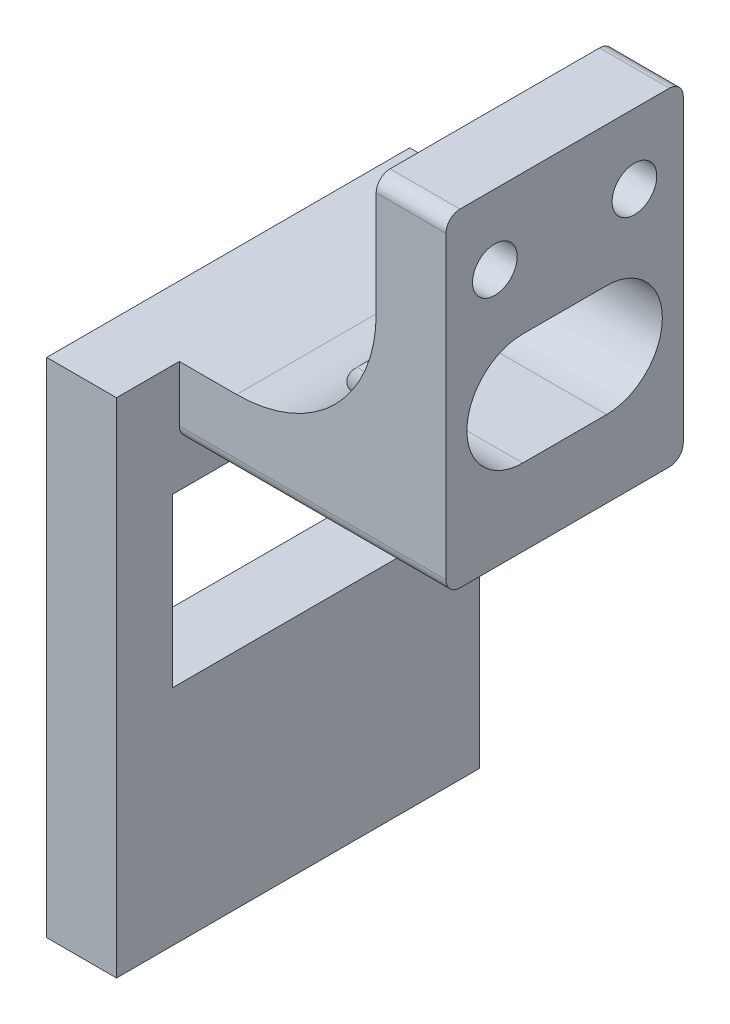
ISO-10303-21;
HEADER;
FILE_DESCRIPTION(('STEP AP214'),'2;1');
FILE_NAME('part.step','',(''),(''),'','','');
FILE_SCHEMA(('AUTOMOTIVE_DESIGN { 1 0 10303 214 1 1 1 1 }'));
ENDSEC;
DATA;
#1=APPLICATION_CONTEXT('core data for automotive mechanical design processes');
#2=APPLICATION_PROTOCOL_DEFINITION('international standard','automotive_design',2000,#1);
#3=PRODUCT_CONTEXT('',#1,'mechanical');
#4=PRODUCT('Part','Part','',(#3));
#5=PRODUCT_RELATED_PRODUCT_CATEGORY('part','',(#4));
#6=PRODUCT_DEFINITION_FORMATION('','',#4);
#7=PRODUCT_DEFINITION_CONTEXT('part definition',#1,'design');
#8=PRODUCT_DEFINITION('design','',#6,#7);
#9=PRODUCT_DEFINITION_SHAPE('','',#8);
#10=(LENGTH_UNIT() NAMED_UNIT(*) SI_UNIT(.MILLI.,.METRE.));
#11=(NAMED_UNIT(*) PLANE_ANGLE_UNIT() SI_UNIT($,.RADIAN.));
#12=(NAMED_UNIT(*) SI_UNIT($,.STERADIAN.) SOLID_ANGLE_UNIT());
#13=UNCERTAINTY_MEASURE_WITH_UNIT(LENGTH_MEASURE(1.E-05),#10,'distance_accuracy_value','');
#14=(GEOMETRIC_REPRESENTATION_CONTEXT(3) GLOBAL_UNCERTAINTY_ASSIGNED_CONTEXT((#13)) GLOBAL_UNIT_ASSIGNED_CONTEXT((#10,
#11,#12)) REPRESENTATION_CONTEXT('',''));
#15=CARTESIAN_POINT('',(0.,0.,0.));
#16=DIRECTION('',(0.,0.,1.));
#17=DIRECTION('',(1.,0.,0.));
#18=AXIS2_PLACEMENT_3D('',#15,#16,#17);
#19=CARTESIAN_POINT('',(-3.,27.5,0.));
#20=DIRECTION('',(0.,-1.,0.));
#21=DIRECTION('',(0.,0.,-1.));
#22=AXIS2_PLACEMENT_3D('',#19,#20,#21);
#23=PLANE('',#22);
#24=DIRECTION('',(-1.,0.,0.));
#25=VECTOR('',#24,1.);
#26=CARTESIAN_POINT('',(16.1,27.5,8.49999999999999));
#27=LINE('',#26,#25);
#28=CARTESIAN_POINT('',(1.10000000000003,27.5,8.49999999999999));
#29=VERTEX_POINT('',#28);
#30=CARTESIAN_POINT('',(-3.,27.5,8.49999999999999));
#31=VERTEX_POINT('',#30);
#32=EDGE_CURVE('E243',#29,#31,#27,.T.);
#33=ORIENTED_EDGE('',*,*,#32,.F.);
#34=DIRECTION('',(0.,0.,1.));
#35=VECTOR('',#34,1.);
#36=CARTESIAN_POINT('',(1.10000000000003,27.5,-8.49999999999998));
#37=LINE('',#36,#35);
#38=CARTESIAN_POINT('',(1.10000000000003,27.5,-8.49999999999998));
#39=VERTEX_POINT('',#38);
#40=EDGE_CURVE('E323',#29,#39,#37,.F.);
#41=ORIENTED_EDGE('',*,*,#40,.T.);
#42=DIRECTION('',(-1.,0.,0.));
#43=VECTOR('',#42,1.);
#44=CARTESIAN_POINT('',(16.1,27.5,-8.49999999999998));
#45=LINE('',#44,#43);
#46=CARTESIAN_POINT('',(-3.,27.5,-8.49999999999998));
#47=VERTEX_POINT('',#46);
#48=EDGE_CURVE('E245',#39,#47,#45,.T.);
#49=ORIENTED_EDGE('',*,*,#48,.T.);
#50=DIRECTION('',(0.,0.,1.));
#51=VECTOR('',#50,1.);
#52=CARTESIAN_POINT('',(-3.,27.5,0.));
#53=LINE('',#52,#51);
#54=CARTESIAN_POINT('',(-3.,27.5,-13.));
#55=VERTEX_POINT('',#54);
#56=EDGE_CURVE('E261',#55,#47,#53,.T.);
#57=ORIENTED_EDGE('',*,*,#56,.F.);
#58=DIRECTION('',(-1.,0.,0.));
#59=VECTOR('',#58,1.);
#60=CARTESIAN_POINT('',(-3.,27.5,-13.));
#61=LINE('',#60,#59);
#62=CARTESIAN_POINT('',(-7.99999999999999,27.5,-13.));
#63=VERTEX_POINT('',#62);
#64=EDGE_CURVE('E306',#55,#63,#61,.T.);
#65=ORIENTED_EDGE('',*,*,#64,.T.);
#66=DIRECTION('',(0.,0.,1.));
#67=VECTOR('',#66,1.);
#68=CARTESIAN_POINT('',(-7.99999999999999,27.5,0.));
#69=LINE('',#68,#67);
#70=CARTESIAN_POINT('',(-7.99999999999999,27.5,13.));
#71=VERTEX_POINT('',#70);
#72=EDGE_CURVE('E284',#63,#71,#69,.T.);
#73=ORIENTED_EDGE('',*,*,#72,.T.);
#74=DIRECTION('',(-1.,0.,0.));
#75=VECTOR('',#74,1.);
#76=CARTESIAN_POINT('',(-3.,27.5,13.));
#77=LINE('',#76,#75);
#78=CARTESIAN_POINT('',(-3.,27.5,13.));
#79=VERTEX_POINT('',#78);
#80=EDGE_CURVE('E317',#79,#71,#77,.T.);
#81=ORIENTED_EDGE('',*,*,#80,.F.);
#82=EDGE_CURVE('E259',#31,#79,#53,.T.);
#83=ORIENTED_EDGE('',*,*,#82,.F.);
#84=EDGE_LOOP('',(#33,#41,#49,#57,#65,#73,#81,#83));
#85=FACE_BOUND('',#84,.T.);
#86=ADVANCED_FACE('F39',(#85),#23,.F.);
#87=CARTESIAN_POINT('',(-3.,19.5,0.));
#88=DIRECTION('',(0.,-1.,0.));
#89=DIRECTION('',(0.,0.,-1.));
#90=AXIS2_PLACEMENT_3D('',#87,#88,#89);
#91=PLANE('',#90);
#92=DIRECTION('',(0.,0.,1.));
#93=VECTOR('',#92,1.);
#94=CARTESIAN_POINT('',(-7.99999999999999,19.5,0.));
#95=LINE('',#94,#93);
#96=CARTESIAN_POINT('',(-7.99999999999999,19.5,-9.));
#97=VERTEX_POINT('',#96);
#98=CARTESIAN_POINT('',(-7.99999999999999,19.5,9.));
#99=VERTEX_POINT('',#98);
#100=EDGE_CURVE('E292',#97,#99,#95,.T.);
#101=ORIENTED_EDGE('',*,*,#100,.F.);
#102=DIRECTION('',(-1.,0.,0.));
#103=VECTOR('',#102,1.);
#104=CARTESIAN_POINT('',(-3.,19.5,-9.));
#105=LINE('',#104,#103);
#106=CARTESIAN_POINT('',(-3.,19.5,-9.));
#107=VERTEX_POINT('',#106);
#108=EDGE_CURVE('E311',#107,#97,#105,.T.);
#109=ORIENTED_EDGE('',*,*,#108,.F.);
#110=DIRECTION('',(0.,0.,1.));
#111=VECTOR('',#110,1.);
#112=CARTESIAN_POINT('',(-3.,19.5,0.));
#113=LINE('',#112,#111);
#114=CARTESIAN_POINT('',(-3.,19.5,9.));
#115=VERTEX_POINT('',#114);
#116=EDGE_CURVE('E270',#107,#115,#113,.T.);
#117=ORIENTED_EDGE('',*,*,#116,.T.);
#118=DIRECTION('',(-1.,0.,0.));
#119=VECTOR('',#118,1.);
#120=CARTESIAN_POINT('',(-3.,19.5,9.));
#121=LINE('',#120,#119);
#122=EDGE_CURVE('E303',#115,#99,#121,.T.);
#123=ORIENTED_EDGE('',*,*,#122,.T.);
#124=EDGE_LOOP('',(#101,#109,#117,#123));
#125=FACE_BOUND('',#124,.T.);
#126=ADVANCED_FACE('F385',(#125),#91,.T.);
#127=CARTESIAN_POINT('',(-3.,0.,-9.));
#128=DIRECTION('',(0.,0.,-1.));
#129=DIRECTION('',(0.,1.,0.));
#130=AXIS2_PLACEMENT_3D('',#127,#128,#129);
#131=PLANE('',#130);
#132=DIRECTION('',(0.,-1.,0.));
#133=VECTOR('',#132,1.);
#134=CARTESIAN_POINT('',(-7.99999999999999,0.,-9.));
#135=LINE('',#134,#133);
#136=CARTESIAN_POINT('',(-7.99999999999999,7.5,-9.));
#137=VERTEX_POINT('',#136);
#138=EDGE_CURVE('E295',#97,#137,#135,.T.);
#139=ORIENTED_EDGE('',*,*,#138,.T.);
#140=DIRECTION('',(-1.,0.,0.));
#141=VECTOR('',#140,1.);
#142=CARTESIAN_POINT('',(-3.,7.5,-9.));
#143=LINE('',#142,#141);
#144=CARTESIAN_POINT('',(-3.,7.5,-9.));
#145=VERTEX_POINT('',#144);
#146=EDGE_CURVE('E308',#145,#137,#143,.T.);
#147=ORIENTED_EDGE('',*,*,#146,.F.);
#148=DIRECTION('',(0.,-1.,0.));
#149=VECTOR('',#148,1.);
#150=CARTESIAN_POINT('',(-3.,0.,-9.));
#151=LINE('',#150,#149);
#152=EDGE_CURVE('E273',#107,#145,#151,.T.);
#153=ORIENTED_EDGE('',*,*,#152,.F.);
#154=ORIENTED_EDGE('',*,*,#108,.T.);
#155=EDGE_LOOP('',(#139,#147,#153,#154));
#156=FACE_BOUND('',#155,.T.);
#157=ADVANCED_FACE('F381',(#156),#131,.F.);
#158=CARTESIAN_POINT('',(-3.,7.5,0.));
#159=DIRECTION('',(0.,-1.,0.));
#160=DIRECTION('',(0.,0.,-1.));
#161=AXIS2_PLACEMENT_3D('',#158,#159,#160);
#162=PLANE('',#161);
#163=DIRECTION('',(0.,0.,1.));
#164=VECTOR('',#163,1.);
#165=CARTESIAN_POINT('',(-7.99999999999999,7.5,0.));
#166=LINE('',#165,#164);
#167=CARTESIAN_POINT('',(-7.99999999999999,7.5,9.00000000000001));
#168=VERTEX_POINT('',#167);
#169=EDGE_CURVE('E298',#137,#168,#166,.T.);
#170=ORIENTED_EDGE('',*,*,#169,.T.);
#171=DIRECTION('',(-1.,0.,0.));
#172=VECTOR('',#171,1.);
#173=CARTESIAN_POINT('',(-3.,7.5,9.00000000000001));
#174=LINE('',#173,#172);
#175=CARTESIAN_POINT('',(-3.,7.5,9.00000000000001));
#176=VERTEX_POINT('',#175);
#177=EDGE_CURVE('E305',#176,#168,#174,.T.);
#178=ORIENTED_EDGE('',*,*,#177,.F.);
#179=DIRECTION('',(0.,0.,1.));
#180=VECTOR('',#179,1.);
#181=CARTESIAN_POINT('',(-3.,7.5,0.));
#182=LINE('',#181,#180);
#183=EDGE_CURVE('E276',#145,#176,#182,.T.);
#184=ORIENTED_EDGE('',*,*,#183,.F.);
#185=ORIENTED_EDGE('',*,*,#146,.T.);
#186=EDGE_LOOP('',(#170,#178,#184,#185));
#187=FACE_BOUND('',#186,.T.);
#188=ADVANCED_FACE('F377',(#187),#162,.F.);
#189=CARTESIAN_POINT('',(-3.,0.,-13.));
#190=DIRECTION('',(0.,0.,-1.));
#191=DIRECTION('',(0.,1.,0.));
#192=AXIS2_PLACEMENT_3D('',#189,#190,#191);
#193=PLANE('',#192);
#194=DIRECTION('',(0.,-1.,0.));
#195=VECTOR('',#194,1.);
#196=CARTESIAN_POINT('',(-7.99999999999999,0.,-13.));
#197=LINE('',#196,#195);
#198=CARTESIAN_POINT('',(-7.99999999999999,-8.5,-13.));
#199=VERTEX_POINT('',#198);
#200=EDGE_CURVE('E255',#63,#199,#197,.T.);
#201=ORIENTED_EDGE('',*,*,#200,.F.);
#202=ORIENTED_EDGE('',*,*,#64,.F.);
#203=DIRECTION('',(0.,-1.,0.));
#204=VECTOR('',#203,1.);
#205=CARTESIAN_POINT('',(-3.,0.,-13.));
#206=LINE('',#205,#204);
#207=CARTESIAN_POINT('',(-3.,-8.5,-13.));
#208=VERTEX_POINT('',#207);
#209=EDGE_CURVE('E256',#55,#208,#206,.T.);
#210=ORIENTED_EDGE('',*,*,#209,.T.);
#211=DIRECTION('',(-1.,0.,0.));
#212=VECTOR('',#211,1.);
#213=CARTESIAN_POINT('',(-3.,-8.5,-13.));
#214=LINE('',#213,#212);
#215=EDGE_CURVE('E281',#208,#199,#214,.T.);
#216=ORIENTED_EDGE('',*,*,#215,.T.);
#217=EDGE_LOOP('',(#201,#202,#210,#216));
#218=FACE_BOUND('',#217,.T.);
#219=ADVANCED_FACE('F380',(#218),#193,.T.);
#220=CARTESIAN_POINT('',(-3.,0.,13.));
#221=DIRECTION('',(0.,0.,1.));
#222=DIRECTION('',(0.,-1.,0.));
#223=AXIS2_PLACEMENT_3D('',#220,#221,#222);
#224=PLANE('',#223);
#225=DIRECTION('',(0.,1.,0.));
#226=VECTOR('',#225,1.);
#227=CARTESIAN_POINT('',(-7.99999999999999,0.,13.));
#228=LINE('',#227,#226);
#229=CARTESIAN_POINT('',(-7.99999999999999,-8.5,13.));
#230=VERTEX_POINT('',#229);
#231=EDGE_CURVE('E286',#230,#71,#228,.T.);
#232=ORIENTED_EDGE('',*,*,#231,.F.);
#233=DIRECTION('',(-1.,0.,0.));
#234=VECTOR('',#233,1.);
#235=CARTESIAN_POINT('',(-3.,-8.5,13.));
#236=LINE('',#235,#234);
#237=CARTESIAN_POINT('',(-3.,-8.5,13.));
#238=VERTEX_POINT('',#237);
#239=EDGE_CURVE('E315',#238,#230,#236,.T.);
#240=ORIENTED_EDGE('',*,*,#239,.F.);
#241=DIRECTION('',(0.,1.,0.));
#242=VECTOR('',#241,1.);
#243=CARTESIAN_POINT('',(-3.,0.,13.));
#244=LINE('',#243,#242);
#245=EDGE_CURVE('E264',#238,#79,#244,.T.);
#246=ORIENTED_EDGE('',*,*,#245,.T.);
#247=ORIENTED_EDGE('',*,*,#80,.T.);
#248=EDGE_LOOP('',(#232,#240,#246,#247));
#249=FACE_BOUND('',#248,.T.);
#250=ADVANCED_FACE('F392',(#249),#224,.T.);
#251=CARTESIAN_POINT('',(-3.,-8.5,0.));
#252=DIRECTION('',(0.,-1.,0.));
#253=DIRECTION('',(0.,0.,-1.));
#254=AXIS2_PLACEMENT_3D('',#251,#252,#253);
#255=PLANE('',#254);
#256=DIRECTION('',(0.,0.,1.));
#257=VECTOR('',#256,1.);
#258=CARTESIAN_POINT('',(-7.99999999999999,-8.5,0.));
#259=LINE('',#258,#257);
#260=EDGE_CURVE('E289',#199,#230,#259,.T.);
#261=ORIENTED_EDGE('',*,*,#260,.F.);
#262=ORIENTED_EDGE('',*,*,#215,.F.);
#263=DIRECTION('',(0.,0.,1.));
#264=VECTOR('',#263,1.);
#265=CARTESIAN_POINT('',(-3.,-8.5,0.));
#266=LINE('',#265,#264);
#267=EDGE_CURVE('E267',#208,#238,#266,.T.);
#268=ORIENTED_EDGE('',*,*,#267,.T.);
#269=ORIENTED_EDGE('',*,*,#239,.T.);
#270=EDGE_LOOP('',(#261,#262,#268,#269));
#271=FACE_BOUND('',#270,.T.);
#272=ADVANCED_FACE('F375',(#271),#255,.T.);
#273=CARTESIAN_POINT('',(-3.,0.,9.00000000000001));
#274=DIRECTION('',(0.,0.,-1.));
#275=DIRECTION('',(0.,1.,0.));
#276=AXIS2_PLACEMENT_3D('',#273,#274,#275);
#277=PLANE('',#276);
#278=DIRECTION('',(0.,-1.,0.));
#279=VECTOR('',#278,1.);
#280=CARTESIAN_POINT('',(-7.99999999999999,0.,9.00000000000001));
#281=LINE('',#280,#279);
#282=EDGE_CURVE('E260',#99,#168,#281,.T.);
#283=ORIENTED_EDGE('',*,*,#282,.F.);
#284=ORIENTED_EDGE('',*,*,#122,.F.);
#285=DIRECTION('',(0.,-1.,0.));
#286=VECTOR('',#285,1.);
#287=CARTESIAN_POINT('',(-3.,0.,9.00000000000001));
#288=LINE('',#287,#286);
#289=EDGE_CURVE('E278',#115,#176,#288,.T.);
#290=ORIENTED_EDGE('',*,*,#289,.T.);
#291=ORIENTED_EDGE('',*,*,#177,.T.);
#292=EDGE_LOOP('',(#283,#284,#290,#291));
#293=FACE_BOUND('',#292,.T.);
#294=ADVANCED_FACE('F369',(#293),#277,.T.);
#295=CARTESIAN_POINT('',(-3.,0.,0.));
#296=DIRECTION('',(1.,0.,0.));
#297=DIRECTION('',(0.,0.,-1.));
#298=AXIS2_PLACEMENT_3D('',#295,#296,#297);
#299=PLANE('',#298);
#300=DIRECTION('',(0.,1.,0.));
#301=VECTOR('',#300,1.);
#302=CARTESIAN_POINT('',(-3.,0.,-8.49999999999998));
#303=LINE('',#302,#301);
#304=CARTESIAN_POINT('',(-3.,23.5,-8.49999999999998));
#305=VERTEX_POINT('',#304);
#306=EDGE_CURVE('E253',#305,#47,#303,.T.);
#307=ORIENTED_EDGE('',*,*,#306,.F.);
#308=CARTESIAN_POINT('',(-3.,23.5,-7.49999999999998));
#309=DIRECTION('',(1.,0.,0.));
#310=DIRECTION('',(0.,0.,-1.));
#311=AXIS2_PLACEMENT_3D('',#308,#309,#310);
#312=CIRCLE('',#311,1.);
#313=CARTESIAN_POINT('',(-3.,22.5,-7.49999999999998));
#314=VERTEX_POINT('',#313);
#315=EDGE_CURVE('E11',#305,#314,#312,.F.);
#316=ORIENTED_EDGE('',*,*,#315,.T.);
#317=DIRECTION('',(0.,0.,-1.));
#318=VECTOR('',#317,1.);
#319=CARTESIAN_POINT('',(-3.,22.5,0.));
#320=LINE('',#319,#318);
#321=CARTESIAN_POINT('',(-3.,22.5,7.49999999999998));
#322=VERTEX_POINT('',#321);
#323=EDGE_CURVE('E248',#322,#314,#320,.T.);
#324=ORIENTED_EDGE('',*,*,#323,.F.);
#325=CARTESIAN_POINT('',(-3.,23.5,7.49999999999998));
#326=DIRECTION('',(1.,0.,0.));
#327=DIRECTION('',(0.,0.,-1.));
#328=AXIS2_PLACEMENT_3D('',#325,#326,#327);
#329=CIRCLE('',#328,1.);
#330=CARTESIAN_POINT('',(-3.,23.5,8.49999999999999));
#331=VERTEX_POINT('',#330);
#332=EDGE_CURVE('E47',#322,#331,#329,.F.);
#333=ORIENTED_EDGE('',*,*,#332,.T.);
#334=DIRECTION('',(0.,-1.,0.));
#335=VECTOR('',#334,1.);
#336=CARTESIAN_POINT('',(-3.,0.,8.49999999999999));
#337=LINE('',#336,#335);
#338=EDGE_CURVE('E250',#31,#331,#337,.T.);
#339=ORIENTED_EDGE('',*,*,#338,.F.);
#340=ORIENTED_EDGE('',*,*,#82,.T.);
#341=ORIENTED_EDGE('',*,*,#245,.F.);
#342=ORIENTED_EDGE('',*,*,#267,.F.);
#343=ORIENTED_EDGE('',*,*,#209,.F.);
#344=ORIENTED_EDGE('',*,*,#56,.T.);
#345=EDGE_LOOP('',(#307,#316,#324,#333,#339,#340,#341,#342,#343,#344));
#346=FACE_BOUND('',#345,.T.);
#347=ORIENTED_EDGE('',*,*,#116,.F.);
#348=ORIENTED_EDGE('',*,*,#152,.T.);
#349=ORIENTED_EDGE('',*,*,#183,.T.);
#350=ORIENTED_EDGE('',*,*,#289,.F.);
#351=EDGE_LOOP('',(#347,#348,#349,#350));
#352=FACE_BOUND('',#351,.T.);
#353=ADVANCED_FACE('F366',(#346,#352),#299,.T.);
#354=CARTESIAN_POINT('',(-7.99999999999999,0.,0.));
#355=DIRECTION('',(1.,0.,0.));
#356=DIRECTION('',(0.,0.,-1.));
#357=AXIS2_PLACEMENT_3D('',#354,#355,#356);
#358=PLANE('',#357);
#359=ORIENTED_EDGE('',*,*,#231,.T.);
#360=ORIENTED_EDGE('',*,*,#72,.F.);
#361=ORIENTED_EDGE('',*,*,#200,.T.);
#362=ORIENTED_EDGE('',*,*,#260,.T.);
#363=EDGE_LOOP('',(#359,#360,#361,#362));
#364=FACE_BOUND('',#363,.T.);
#365=ORIENTED_EDGE('',*,*,#100,.T.);
#366=ORIENTED_EDGE('',*,*,#282,.T.);
#367=ORIENTED_EDGE('',*,*,#169,.F.);
#368=ORIENTED_EDGE('',*,*,#138,.F.);
#369=EDGE_LOOP('',(#365,#366,#367,#368));
#370=FACE_BOUND('',#369,.T.);
#371=ADVANCED_FACE('F364',(#364,#370),#358,.F.);
#372=CARTESIAN_POINT('',(16.1,0.,-8.49999999999998));
#373=DIRECTION('',(0.,0.,-1.));
#374=DIRECTION('',(0.,1.,0.));
#375=AXIS2_PLACEMENT_3D('',#372,#373,#374);
#376=PLANE('',#375);
#377=DIRECTION('',(0.,-1.,0.));
#378=VECTOR('',#377,1.);
#379=CARTESIAN_POINT('',(11.1,0.,-8.49999999999998));
#380=LINE('',#379,#378);
#381=CARTESIAN_POINT('',(11.1,45.,-8.49999999999999));
#382=VERTEX_POINT('',#381);
#383=CARTESIAN_POINT('',(11.1,37.5,-8.49999999999998));
#384=VERTEX_POINT('',#383);
#385=EDGE_CURVE('E471',#382,#384,#380,.T.);
#386=ORIENTED_EDGE('',*,*,#385,.F.);
#387=DIRECTION('',(1.,0.,0.));
#388=VECTOR('',#387,1.);
#389=CARTESIAN_POINT('',(16.1,45.,-8.49999999999999));
#390=LINE('',#389,#388);
#391=CARTESIAN_POINT('',(16.1,45.,-8.49999999999999));
#392=VERTEX_POINT('',#391);
#393=EDGE_CURVE('E438',#382,#392,#390,.T.);
#394=ORIENTED_EDGE('',*,*,#393,.T.);
#395=DIRECTION('',(0.,-1.,0.));
#396=VECTOR('',#395,1.);
#397=CARTESIAN_POINT('',(16.1,0.,-8.49999999999998));
#398=LINE('',#397,#396);
#399=CARTESIAN_POINT('',(16.1,23.5,-8.49999999999998));
#400=VERTEX_POINT('',#399);
#401=EDGE_CURVE('E230',#392,#400,#398,.T.);
#402=ORIENTED_EDGE('',*,*,#401,.T.);
#403=DIRECTION('',(-1.,0.,0.));
#404=VECTOR('',#403,1.);
#405=CARTESIAN_POINT('',(16.1,23.5,-8.49999999999998));
#406=LINE('',#405,#404);
#407=EDGE_CURVE('E435',#400,#305,#406,.T.);
#408=ORIENTED_EDGE('',*,*,#407,.T.);
#409=ORIENTED_EDGE('',*,*,#306,.T.);
#410=ORIENTED_EDGE('',*,*,#48,.F.);
#411=CARTESIAN_POINT('',(1.10000000000003,37.5,-8.49999999999998));
#412=DIRECTION('',(0.,0.,-1.));
#413=DIRECTION('',(0.,1.,0.));
#414=AXIS2_PLACEMENT_3D('',#411,#412,#413);
#415=CIRCLE('',#414,10.);
#416=EDGE_CURVE('E327',#39,#384,#415,.F.);
#417=ORIENTED_EDGE('',*,*,#416,.T.);
#418=EDGE_LOOP('',(#386,#394,#402,#408,#409,#410,#417));
#419=FACE_BOUND('',#418,.T.);
#420=ADVANCED_FACE('F360',(#419),#376,.T.);
#421=CARTESIAN_POINT('',(16.1,0.,8.49999999999999));
#422=DIRECTION('',(0.,0.,1.));
#423=DIRECTION('',(1.,0.,0.));
#424=AXIS2_PLACEMENT_3D('',#421,#422,#423);
#425=PLANE('',#424);
#426=DIRECTION('',(0.,1.,0.));
#427=VECTOR('',#426,1.);
#428=CARTESIAN_POINT('',(16.1,0.,8.49999999999999));
#429=LINE('',#428,#427);
#430=CARTESIAN_POINT('',(16.1,23.5,8.49999999999999));
#431=VERTEX_POINT('',#430);
#432=CARTESIAN_POINT('',(16.1,45.,8.49999999999999));
#433=VERTEX_POINT('',#432);
#434=EDGE_CURVE('E237',#431,#433,#429,.T.);
#435=ORIENTED_EDGE('',*,*,#434,.T.);
#436=DIRECTION('',(1.,0.,0.));
#437=VECTOR('',#436,1.);
#438=CARTESIAN_POINT('',(11.1,45.,8.49999999999999));
#439=LINE('',#438,#437);
#440=CARTESIAN_POINT('',(11.1,45.,8.49999999999999));
#441=VERTEX_POINT('',#440);
#442=EDGE_CURVE('E423',#433,#441,#439,.F.);
#443=ORIENTED_EDGE('',*,*,#442,.T.);
#444=DIRECTION('',(0.,1.,0.));
#445=VECTOR('',#444,1.);
#446=CARTESIAN_POINT('',(11.1,0.,8.49999999999999));
#447=LINE('',#446,#445);
#448=CARTESIAN_POINT('',(11.1,37.5,8.49999999999999));
#449=VERTEX_POINT('',#448);
#450=EDGE_CURVE('E205',#449,#441,#447,.T.);
#451=ORIENTED_EDGE('',*,*,#450,.F.);
#452=CARTESIAN_POINT('',(1.10000000000003,37.5,8.49999999999999));
#453=DIRECTION('',(0.,0.,1.));
#454=DIRECTION('',(1.,0.,0.));
#455=AXIS2_PLACEMENT_3D('',#452,#453,#454);
#456=CIRCLE('',#455,10.);
#457=EDGE_CURVE('E325',#449,#29,#456,.F.);
#458=ORIENTED_EDGE('',*,*,#457,.T.);
#459=ORIENTED_EDGE('',*,*,#32,.T.);
#460=ORIENTED_EDGE('',*,*,#338,.T.);
#461=DIRECTION('',(-1.,0.,0.));
#462=VECTOR('',#461,1.);
#463=CARTESIAN_POINT('',(16.1,23.5,8.49999999999999));
#464=LINE('',#463,#462);
#465=EDGE_CURVE('E418',#331,#431,#464,.F.);
#466=ORIENTED_EDGE('',*,*,#465,.T.);
#467=EDGE_LOOP('',(#435,#443,#451,#458,#459,#460,#466));
#468=FACE_BOUND('',#467,.T.);
#469=ADVANCED_FACE('F356',(#468),#425,.T.);
#470=CARTESIAN_POINT('',(16.1,22.5,0.));
#471=DIRECTION('',(0.,-1.,0.));
#472=DIRECTION('',(0.,0.,-1.));
#473=AXIS2_PLACEMENT_3D('',#470,#471,#472);
#474=PLANE('',#473);
#475=DIRECTION('',(0.,0.,1.));
#476=VECTOR('',#475,1.);
#477=CARTESIAN_POINT('',(16.1,22.5,0.));
#478=LINE('',#477,#476);
#479=CARTESIAN_POINT('',(16.1,22.5,-7.49999999999998));
#480=VERTEX_POINT('',#479);
#481=CARTESIAN_POINT('',(16.1,22.5,7.49999999999998));
#482=VERTEX_POINT('',#481);
#483=EDGE_CURVE('E240',#480,#482,#478,.T.);
#484=ORIENTED_EDGE('',*,*,#483,.T.);
#485=DIRECTION('',(-1.,0.,0.));
#486=VECTOR('',#485,1.);
#487=CARTESIAN_POINT('',(16.1,22.5,7.49999999999998));
#488=LINE('',#487,#486);
#489=EDGE_CURVE('E443',#482,#322,#488,.T.);
#490=ORIENTED_EDGE('',*,*,#489,.T.);
#491=ORIENTED_EDGE('',*,*,#323,.T.);
#492=DIRECTION('',(-1.,0.,0.));
#493=VECTOR('',#492,1.);
#494=CARTESIAN_POINT('',(16.1,22.5,-7.49999999999998));
#495=LINE('',#494,#493);
#496=EDGE_CURVE('E441',#314,#480,#495,.F.);
#497=ORIENTED_EDGE('',*,*,#496,.T.);
#498=EDGE_LOOP('',(#484,#490,#491,#497));
#499=FACE_BOUND('',#498,.T.);
#500=ADVANCED_FACE('F352',(#499),#474,.T.);
#501=CARTESIAN_POINT('',(16.1,0.,0.));
#502=DIRECTION('',(1.,0.,0.));
#503=DIRECTION('',(0.,0.,-1.));
#504=AXIS2_PLACEMENT_3D('',#501,#502,#503);
#505=PLANE('',#504);
#506=CARTESIAN_POINT('',(16.1,41.,5.));
#507=DIRECTION('',(-1.,0.,0.));
#508=DIRECTION('',(0.,0.,1.));
#509=AXIS2_PLACEMENT_3D('',#506,#507,#508);
#510=CIRCLE('',#509,1.59999999999999);
#511=CARTESIAN_POINT('',(16.1,41.,6.59999999999999));
#512=VERTEX_POINT('',#511);
#513=EDGE_CURVE('E506',#512,#512,#510,.T.);
#514=ORIENTED_EDGE('',*,*,#513,.T.);
#515=EDGE_LOOP('',(#514));
#516=FACE_BOUND('',#515,.T.);
#517=CARTESIAN_POINT('',(16.1,41.,-5.));
#518=DIRECTION('',(-1.,0.,0.));
#519=DIRECTION('',(0.,0.,1.));
#520=AXIS2_PLACEMENT_3D('',#517,#518,#519);
#521=CIRCLE('',#520,1.59999999999999);
#522=CARTESIAN_POINT('',(16.1,41.,-3.40000000000001));
#523=VERTEX_POINT('',#522);
#524=EDGE_CURVE('E214',#523,#523,#521,.T.);
#525=ORIENTED_EDGE('',*,*,#524,.T.);
#526=EDGE_LOOP('',(#525));
#527=FACE_BOUND('',#526,.T.);
#528=DIRECTION('',(0.,0.,-1.));
#529=VECTOR('',#528,1.);
#530=CARTESIAN_POINT('',(16.1,46.,0.));
#531=LINE('',#530,#529);
#532=CARTESIAN_POINT('',(16.1,46.,7.49999999999998));
#533=VERTEX_POINT('',#532);
#534=CARTESIAN_POINT('',(16.1,46.,-7.49999999999998));
#535=VERTEX_POINT('',#534);
#536=EDGE_CURVE('E225',#533,#535,#531,.T.);
#537=ORIENTED_EDGE('',*,*,#536,.F.);
#538=CARTESIAN_POINT('',(16.1,45.,7.49999999999998));
#539=DIRECTION('',(1.,0.,0.));
#540=DIRECTION('',(0.,0.,-1.));
#541=AXIS2_PLACEMENT_3D('',#538,#539,#540);
#542=CIRCLE('',#541,1.);
#543=EDGE_CURVE('E424',#533,#433,#542,.T.);
#544=ORIENTED_EDGE('',*,*,#543,.T.);
#545=ORIENTED_EDGE('',*,*,#434,.F.);
#546=CARTESIAN_POINT('',(16.1,23.5,7.49999999999998));
#547=DIRECTION('',(1.,0.,0.));
#548=DIRECTION('',(0.,0.,-1.));
#549=AXIS2_PLACEMENT_3D('',#546,#547,#548);
#550=CIRCLE('',#549,1.);
#551=EDGE_CURVE('E422',#431,#482,#550,.T.);
#552=ORIENTED_EDGE('',*,*,#551,.T.);
#553=ORIENTED_EDGE('',*,*,#483,.F.);
#554=CARTESIAN_POINT('',(16.1,23.5,-7.49999999999998));
#555=DIRECTION('',(1.,0.,0.));
#556=DIRECTION('',(0.,0.,-1.));
#557=AXIS2_PLACEMENT_3D('',#554,#555,#556);
#558=CIRCLE('',#557,1.);
#559=EDGE_CURVE('E450',#480,#400,#558,.T.);
#560=ORIENTED_EDGE('',*,*,#559,.T.);
#561=ORIENTED_EDGE('',*,*,#401,.F.);
#562=CARTESIAN_POINT('',(16.1,45.,-7.49999999999998));
#563=DIRECTION('',(1.,0.,0.));
#564=DIRECTION('',(0.,0.,-1.));
#565=AXIS2_PLACEMENT_3D('',#562,#563,#564);
#566=CIRCLE('',#565,1.);
#567=EDGE_CURVE('E428',#392,#535,#566,.T.);
#568=ORIENTED_EDGE('',*,*,#567,.T.);
#569=EDGE_LOOP('',(#537,#544,#545,#552,#553,#560,#561,#568));
#570=FACE_BOUND('',#569,.T.);
#571=CARTESIAN_POINT('',(16.1,32.,3.));
#572=DIRECTION('',(1.,0.,0.));
#573=DIRECTION('',(0.,0.,-1.));
#574=AXIS2_PLACEMENT_3D('',#571,#572,#573);
#575=CIRCLE('',#574,4.);
#576=CARTESIAN_POINT('',(16.1,36.,3.));
#577=VERTEX_POINT('',#576);
#578=CARTESIAN_POINT('',(16.1,28.,3.));
#579=VERTEX_POINT('',#578);
#580=EDGE_CURVE('E197',#577,#579,#575,.T.);
#581=ORIENTED_EDGE('',*,*,#580,.F.);
#582=DIRECTION('',(0.,0.,-1.));
#583=VECTOR('',#582,1.);
#584=CARTESIAN_POINT('',(16.1,36.,0.));
#585=LINE('',#584,#583);
#586=CARTESIAN_POINT('',(16.1,36.,-3.));
#587=VERTEX_POINT('',#586);
#588=EDGE_CURVE('E211',#577,#587,#585,.T.);
#589=ORIENTED_EDGE('',*,*,#588,.T.);
#590=CARTESIAN_POINT('',(16.1,32.,-3.));
#591=DIRECTION('',(1.,0.,0.));
#592=DIRECTION('',(0.,0.,-1.));
#593=AXIS2_PLACEMENT_3D('',#590,#591,#592);
#594=CIRCLE('',#593,4.);
#595=CARTESIAN_POINT('',(16.1,28.,-3.));
#596=VERTEX_POINT('',#595);
#597=EDGE_CURVE('E219',#596,#587,#594,.T.);
#598=ORIENTED_EDGE('',*,*,#597,.F.);
#599=DIRECTION('',(0.,0.,-1.));
#600=VECTOR('',#599,1.);
#601=CARTESIAN_POINT('',(16.1,28.,0.));
#602=LINE('',#601,#600);
#603=EDGE_CURVE('E212',#579,#596,#602,.T.);
#604=ORIENTED_EDGE('',*,*,#603,.F.);
#605=EDGE_LOOP('',(#581,#589,#598,#604));
#606=FACE_BOUND('',#605,.T.);
#607=ADVANCED_FACE('F209',(#516,#527,#570,#606),#505,.T.);
#608=CARTESIAN_POINT('',(11.1,32.,3.));
#609=DIRECTION('',(1.,0.,0.));
#610=DIRECTION('',(0.,0.,-1.));
#611=AXIS2_PLACEMENT_3D('',#608,#609,#610);
#612=CYLINDRICAL_SURFACE('',#611,4.);
#613=ORIENTED_EDGE('',*,*,#580,.T.);
#614=DIRECTION('',(1.,0.,0.));
#615=VECTOR('',#614,1.);
#616=CARTESIAN_POINT('',(11.1,28.,3.));
#617=LINE('',#616,#615);
#618=CARTESIAN_POINT('',(4.22249899919922,28.,3.));
#619=VERTEX_POINT('',#618);
#620=EDGE_CURVE('E228',#619,#579,#617,.T.);
#621=ORIENTED_EDGE('',*,*,#620,.F.);
#622=CARTESIAN_POINT('',(10.9868599666426,36.,3.));
#623=CARTESIAN_POINT('',(10.9868479827591,36.0000124956564,3.11065273715817));
#624=CARTESIAN_POINT('',(10.9861629937013,35.9954090060291,3.22130452800159));
#625=CARTESIAN_POINT('',(10.9833603553701,35.9770595619022,3.4418281389028));
#626=CARTESIAN_POINT('',(10.9812427211235,35.9633137032952,3.55169996712924));
#627=CARTESIAN_POINT('',(10.9754885008148,35.9267712771089,3.76987447286974));
#628=CARTESIAN_POINT('',(10.9718521021311,35.9039758260456,3.8781773422501));
#629=CARTESIAN_POINT('',(10.9628931775093,35.8495139320419,4.09245620342123));
#630=CARTESIAN_POINT('',(10.9575706849471,35.8178476646995,4.19843224122687));
#631=CARTESIAN_POINT('',(10.9450173447552,35.745871652728,4.40735940266136));
#632=CARTESIAN_POINT('',(10.9377854181495,35.7055570235374,4.51030877932607));
#633=CARTESIAN_POINT('',(10.9211442497524,35.616606069611,4.71241175442091));
#634=CARTESIAN_POINT('',(10.9117342055031,35.567966679608,4.81156393816749));
#635=CARTESIAN_POINT('',(10.8904448131492,35.4628296564918,5.00522828683833));
#636=CARTESIAN_POINT('',(10.8785674955628,35.4063384978036,5.09974418875774));
#637=CARTESIAN_POINT('',(10.8520121816604,35.285940820404,5.28356478144382));
#638=CARTESIAN_POINT('',(10.8373331747026,35.2220316290861,5.37286757648126));
#639=CARTESIAN_POINT('',(10.8050126330426,35.0880653866629,5.54472094061092));
#640=CARTESIAN_POINT('',(10.7874018169336,35.0180753511804,5.62732952889165));
#641=CARTESIAN_POINT('',(10.7488101236003,34.872041304612,5.78622067244468));
#642=CARTESIAN_POINT('',(10.7278280196142,34.7959950948738,5.86250090954382));
#643=CARTESIAN_POINT('',(10.6822387639376,34.638635719326,6.00817093575527));
#644=CARTESIAN_POINT('',(10.6576330622612,34.5573246675476,6.07756346253679));
#645=CARTESIAN_POINT('',(10.6045617434146,34.3901775677784,6.20910669208334));
#646=CARTESIAN_POINT('',(10.5760947236662,34.3043398824984,6.27125474805634));
#647=CARTESIAN_POINT('',(10.515553163567,34.13017143463,6.38720688264458));
#648=CARTESIAN_POINT('',(10.4835310000425,34.0418883160073,6.44110996139387));
#649=CARTESIAN_POINT('',(10.4154915040306,33.8625808796726,6.5413767233548));
#650=CARTESIAN_POINT('',(10.3794727435034,33.7715555906631,6.58773769698055));
#651=CARTESIAN_POINT('',(10.3034521416043,33.5876664548922,6.67281512492297));
#652=CARTESIAN_POINT('',(10.2634519308341,33.4948033731806,6.71153468955518));
#653=CARTESIAN_POINT('',(10.1795189895616,33.308001251495,6.78141441262132));
#654=CARTESIAN_POINT('',(10.1355848134587,33.2140618271504,6.81257177646486));
#655=CARTESIAN_POINT('',(9.99464012211637,32.924818044324,6.89691464363982));
#656=CARTESIAN_POINT('',(9.89126327900113,32.7289088993974,6.93786190442079));
#657=CARTESIAN_POINT('',(9.66977598428343,32.3416240527031,6.99018699436401));
#658=CARTESIAN_POINT('',(9.55165641739181,32.1502512435809,7.00154643379225));
#659=CARTESIAN_POINT('',(9.33990030634386,31.8317495956785,6.99862499697376));
#660=CARTESIAN_POINT('',(9.24939464147155,31.7024028530705,6.9909503034296));
#661=CARTESIAN_POINT('',(9.06296365691927,31.4488879321757,6.96390310001088));
#662=CARTESIAN_POINT('',(8.96703659364466,31.3247214425023,6.94452680711481));
#663=CARTESIAN_POINT('',(8.77044278037766,31.0821560389288,6.89524108973467));
#664=CARTESIAN_POINT('',(8.6697703444902,30.9637644086279,6.86531873599961));
#665=CARTESIAN_POINT('',(8.4644877021805,30.7333059666151,6.79604636075578));
#666=CARTESIAN_POINT('',(8.35987648266358,30.621240800916,6.75669389957231));
#667=CARTESIAN_POINT('',(8.11125966999197,30.3667166935284,6.65472902523723));
#668=CARTESIAN_POINT('',(7.96594835457156,30.2268718282866,6.58875685618546));
#669=CARTESIAN_POINT('',(7.67087139648043,29.9592200107369,6.44360437967718));
#670=CARTESIAN_POINT('',(7.52110393766529,29.8314180575657,6.36441862458868));
#671=CARTESIAN_POINT('',(7.2181267370543,29.5875776649953,6.19411779339115));
#672=CARTESIAN_POINT('',(7.06490955661393,29.4715683753374,6.10297437401114));
#673=CARTESIAN_POINT('',(6.75677004810543,29.2515595914474,5.90989694953952));
#674=CARTESIAN_POINT('',(6.60184826529813,29.1475563724572,5.80796630998268));
#675=CARTESIAN_POINT('',(6.31536151766561,28.9662898194854,5.60993757827554));
#676=CARTESIAN_POINT('',(6.18382634964,28.8873650613934,5.51530870755196));
#677=CARTESIAN_POINT('',(5.92170311287801,28.7379267092916,5.31822985218724));
#678=CARTESIAN_POINT('',(5.79111549766578,28.6674169218093,5.21577636217167));
#679=CARTESIAN_POINT('',(5.53320946221873,28.5352042147962,5.00271161060782));
#680=CARTESIAN_POINT('',(5.40587954538735,28.4734652867934,4.89213670835925));
#681=CARTESIAN_POINT('',(5.15672337450107,28.3587920720631,4.660814925648));
#682=CARTESIAN_POINT('',(5.03489046793264,28.3058469228935,4.54008087629683));
#683=CARTESIAN_POINT('',(4.84025685073249,28.2254285061661,4.32700658159359));
#684=CARTESIAN_POINT('',(4.76450674347699,28.1953042856961,4.2383847520467));
#685=CARTESIAN_POINT('',(4.6207450501206,28.1399654294771,4.05331978522656));
#686=CARTESIAN_POINT('',(4.55273882727615,28.1147541878635,3.95687130560449));
#687=CARTESIAN_POINT('',(4.4423550767018,28.0749596189402,3.77514473784431));
#688=CARTESIAN_POINT('',(4.39757933214948,28.0592574059889,3.69160022404162));
#689=CARTESIAN_POINT('',(4.32075560730429,28.0327731219016,3.51836652759128));
#690=CARTESIAN_POINT('',(4.28863793627889,28.0219640604645,3.4287142704932));
#691=CARTESIAN_POINT('',(4.25151138457216,28.0095730339963,3.28193912095434));
#692=CARTESIAN_POINT('',(4.24078940497904,28.0060261148061,3.22643100295789));
#693=CARTESIAN_POINT('',(4.22621133131705,28.0012199736306,3.1139890183811));
#694=CARTESIAN_POINT('',(4.22241025601708,27.9999790821668,3.05704734415171));
#695=CARTESIAN_POINT('',(4.22249899919922,28.,3.));
#696=B_SPLINE_CURVE_WITH_KNOTS('',3,(#622,#623,#624,#625,#626,#627,#628,#629,#630,#631,#632,
#633,#634,#635,#636,#637,#638,#639,#640,#641,#642,#643,#644,#645,#646,#647,#648,#649,#650,#651,
#652,#653,#654,#655,#656,#657,#658,#659,#660,#661,#662,#663,#664,#665,#666,#667,#668,#669,#670,
#671,#672,#673,#674,#675,#676,#677,#678,#679,#680,#681,#682,#683,#684,#685,#686,#687,#688,#689,
#690,#691,#692,#693,#694,#695),.UNSPECIFIED.,.F.,.F.,(4,2,2,2,2,2,2,2,2,2,2,2,2,2,2,2,2,2,2,2,2,
2,2,2,2,2,2,2,2,2,2,2,2,2,2,2,4),(0.,0.331859181069139,0.663714881385875,0.995529650899871,
1.32733785260345,1.65933395403888,1.99145256406704,2.32329892216363,2.65526521285235,
2.98395005009875,3.31275476289811,3.64142825737252,3.97022145993434,4.29468987392248,
4.61927460062449,4.94372693648032,5.26829899086199,5.94115176936996,6.61442264673494,
7.08798098306385,7.56169249854995,8.03598680631035,8.51040395206267,9.14605276164862,
9.78196428380241,10.4194113004206,11.0566600212344,11.5970276059327,12.1376387077852,
12.6759619023245,13.2136151109621,13.5744688851947,13.9355710785698,14.2230272095016,
14.5088778315475,14.6783630913539,14.8491899132978),.UNSPECIFIED.);
#697=CARTESIAN_POINT('',(10.9868599666426,36.,3.));
#698=VERTEX_POINT('',#697);
#699=EDGE_CURVE('E199',#698,#619,#696,.T.);
#700=ORIENTED_EDGE('',*,*,#699,.F.);
#701=DIRECTION('',(1.,0.,0.));
#702=VECTOR('',#701,1.);
#703=CARTESIAN_POINT('',(11.1,36.,3.));
#704=LINE('',#703,#702);
#705=EDGE_CURVE('E193',#698,#577,#704,.T.);
#706=ORIENTED_EDGE('',*,*,#705,.T.);
#707=EDGE_LOOP('',(#613,#621,#700,#706));
#708=FACE_BOUND('',#707,.T.);
#709=ADVANCED_FACE('F195',(#708),#612,.F.);
#710=CARTESIAN_POINT('',(11.1,28.,0.));
#711=DIRECTION('',(0.,-1.,0.));
#712=DIRECTION('',(0.,0.,-1.));
#713=AXIS2_PLACEMENT_3D('',#710,#711,#712);
#714=PLANE('',#713);
#715=ORIENTED_EDGE('',*,*,#603,.T.);
#716=DIRECTION('',(1.,0.,0.));
#717=VECTOR('',#716,1.);
#718=CARTESIAN_POINT('',(11.1,28.,-3.));
#719=LINE('',#718,#717);
#720=CARTESIAN_POINT('',(4.22249899919922,28.,-3.));
#721=VERTEX_POINT('',#720);
#722=EDGE_CURVE('E231',#721,#596,#719,.T.);
#723=ORIENTED_EDGE('',*,*,#722,.F.);
#724=DIRECTION('',(0.,0.,-1.));
#725=VECTOR('',#724,1.);
#726=CARTESIAN_POINT('',(4.22249899919922,28.,0.));
#727=LINE('',#726,#725);
#728=EDGE_CURVE('E470',#619,#721,#727,.T.);
#729=ORIENTED_EDGE('',*,*,#728,.F.);
#730=ORIENTED_EDGE('',*,*,#620,.T.);
#731=EDGE_LOOP('',(#715,#723,#729,#730));
#732=FACE_BOUND('',#731,.T.);
#733=ADVANCED_FACE('F348',(#732),#714,.F.);
#734=CARTESIAN_POINT('',(11.1,32.,-3.));
#735=DIRECTION('',(1.,0.,0.));
#736=DIRECTION('',(0.,0.,-1.));
#737=AXIS2_PLACEMENT_3D('',#734,#735,#736);
#738=CYLINDRICAL_SURFACE('',#737,4.);
#739=ORIENTED_EDGE('',*,*,#597,.T.);
#740=DIRECTION('',(1.,0.,0.));
#741=VECTOR('',#740,1.);
#742=CARTESIAN_POINT('',(11.1,36.,-3.));
#743=LINE('',#742,#741);
#744=CARTESIAN_POINT('',(10.9868599666426,36.,-3.));
#745=VERTEX_POINT('',#744);
#746=EDGE_CURVE('E204',#745,#587,#743,.T.);
#747=ORIENTED_EDGE('',*,*,#746,.F.);
#748=CARTESIAN_POINT('',(4.22249899919922,28.,-3.));
#749=CARTESIAN_POINT('',(4.22246652807991,27.9999923837606,-3.044781852434));
#750=CARTESIAN_POINT('',(4.2247888173617,28.0007524406776,-3.08952394611712));
#751=CARTESIAN_POINT('',(4.23384600864796,28.0037351933542,-3.17839784994531));
#752=CARTESIAN_POINT('',(4.24056954582667,28.0059541221048,-3.22253093378166));
#753=CARTESIAN_POINT('',(4.26656063930659,28.0145782781521,-3.35179377319119));
#754=CARTESIAN_POINT('',(4.29167428642519,28.0229574364646,-3.43563689706561));
#755=CARTESIAN_POINT('',(4.36563024796153,28.0481403002375,-3.62903708640452));
#756=CARTESIAN_POINT('',(4.41987394794721,28.0669402282101,-3.73616760342819));
#757=CARTESIAN_POINT('',(4.5424486329295,28.1109718394429,-3.9416112799106));
#758=CARTESIAN_POINT('',(4.61091733970251,28.1362670192287,-4.03982363186012));
#759=CARTESIAN_POINT('',(4.76224496731152,28.1943519643803,-4.23628327786281));
#760=CARTESIAN_POINT('',(4.84583282639237,28.2275965434696,-4.33382117855878));
#761=CARTESIAN_POINT('',(5.01879926245502,28.2993578219768,-4.52162781018446));
#762=CARTESIAN_POINT('',(5.10818432539554,28.3378804820709,-4.61188813663542));
#763=CARTESIAN_POINT('',(5.29046314438808,28.419801143611,-4.78646801914325));
#764=CARTESIAN_POINT('',(5.38335781468849,28.463200421304,-4.87078601060842));
#765=CARTESIAN_POINT('',(5.57128541499969,28.5546911942023,-5.03435963625837));
#766=CARTESIAN_POINT('',(5.66631893325195,28.6027839926926,-5.11361385418055));
#767=CARTESIAN_POINT('',(5.93226471573169,28.7429333686503,-5.32775225311226));
#768=CARTESIAN_POINT('',(6.10449479447555,28.8400009099181,-5.45776329850278));
#769=CARTESIAN_POINT('',(6.44951731764983,29.0487620423464,-5.70486991409127));
#770=CARTESIAN_POINT('',(6.62231006589267,29.1604655804815,-5.8219565999649));
#771=CARTESIAN_POINT('',(6.96600760769061,29.3985423386462,-6.04282005462479));
#772=CARTESIAN_POINT('',(7.13691406663644,29.5249012560399,-6.14660959568956));
#773=CARTESIAN_POINT('',(7.47505242961931,29.7925260044777,-6.3398002406571));
#774=CARTESIAN_POINT('',(7.64228645524739,29.9337829396689,-6.4292098514139));
#775=CARTESIAN_POINT('',(7.92304152473571,30.1876344420361,-6.56786621820726));
#776=CARTESIAN_POINT('',(8.03793667049997,30.2964918526202,-6.62120305056706));
#777=CARTESIAN_POINT('',(8.26429583691035,30.5215816803813,-6.7187795080829));
#778=CARTESIAN_POINT('',(8.37576077344514,30.6378121030909,-6.76302157983859));
#779=CARTESIAN_POINT('',(8.59437436730743,30.8772663928582,-6.84126439254254));
#780=CARTESIAN_POINT('',(8.70152877486388,31.0004803765966,-6.87527919751397));
#781=CARTESIAN_POINT('',(8.91085165966752,31.2535975559118,-6.93188137078703));
#782=CARTESIAN_POINT('',(9.01302123608174,31.3834992637272,-6.95447126869109));
#783=CARTESIAN_POINT('',(9.19092298621039,31.6217125512123,-6.98348598454483));
#784=CARTESIAN_POINT('',(9.26774710599697,31.7289215866668,-6.9922901910932));
#785=CARTESIAN_POINT('',(9.41724000528565,31.94653868998,-7.00112422146289));
#786=CARTESIAN_POINT('',(9.4899097671669,32.0569459921639,-7.00115612831853));
#787=CARTESIAN_POINT('',(9.63063997427512,32.2802684220771,-6.9917336143995));
#788=CARTESIAN_POINT('',(9.69870085980624,32.3931833088744,-6.9822801011732));
#789=CARTESIAN_POINT('',(9.82978231678805,32.6206427091437,-6.95321968179993));
#790=CARTESIAN_POINT('',(9.89280282373348,32.7351872434493,-6.93361264573525));
#791=CARTESIAN_POINT('',(10.0139279633635,32.9657974318252,-6.88346174900272));
#792=CARTESIAN_POINT('',(10.0719860411318,33.0818677239996,-6.85282595823091));
#793=CARTESIAN_POINT('',(10.1822674358498,33.3132539277051,-6.78022010961455));
#794=CARTESIAN_POINT('',(10.2344906390987,33.4285698244947,-6.73824983095577));
#795=CARTESIAN_POINT('',(10.3328863924757,33.6569206529624,-6.64278996836742));
#796=CARTESIAN_POINT('',(10.3790622477272,33.7699568017944,-6.5893067193628));
#797=CARTESIAN_POINT('',(10.4653569777193,33.992251287112,-6.47084839921647));
#798=CARTESIAN_POINT('',(10.5054768079837,34.101510217468,-6.40587514449615));
#799=CARTESIAN_POINT('',(10.5746243365329,34.2998517871569,-6.27456843031986));
#800=CARTESIAN_POINT('',(10.6044186835727,34.3896275567423,-6.2096801157155));
#801=CARTESIAN_POINT('',(10.6597994263896,34.5642507227553,-6.07196696066822));
#802=CARTESIAN_POINT('',(10.6853861113176,34.6490984575783,-5.99914266615885));
#803=CARTESIAN_POINT('',(10.7325971366349,34.8129308002439,-5.84604650049849));
#804=CARTESIAN_POINT('',(10.7542227949806,34.8919173530612,-5.76577711999897));
#805=CARTESIAN_POINT('',(10.7938291679343,35.0432149051916,-5.59838218753661));
#806=CARTESIAN_POINT('',(10.8118099239701,35.1155259803728,-5.51125671351549));
#807=CARTESIAN_POINT('',(10.8590199655574,35.3138354334138,-5.25040201466128));
#808=CARTESIAN_POINT('',(10.884031838918,35.4303883388762,-5.06856151887136));
#809=CARTESIAN_POINT('',(10.9247142252031,35.6329788556484,-4.68761258356961));
#810=CARTESIAN_POINT('',(10.9403823324466,35.7190086060451,-4.48849971214904));
#811=CARTESIAN_POINT('',(10.9584972969683,35.823324705108,-4.18070608118949));
#812=CARTESIAN_POINT('',(10.9636455414539,35.8540338559471,-4.07623627146908));
#813=CARTESIAN_POINT('',(10.9723156162052,35.9068555891992,-3.86505067786145));
#814=CARTESIAN_POINT('',(10.9758374132486,35.9289679960118,-3.75833484814311));
#815=CARTESIAN_POINT('',(10.9814128587235,35.9644162085031,-3.54338931649381));
#816=CARTESIAN_POINT('',(10.9834660344701,35.9777491883595,-3.43515913857764));
#817=CARTESIAN_POINT('',(10.9861839554052,35.9955464493029,-3.21795392574415));
#818=CARTESIAN_POINT('',(10.9868486893048,36.0000106582812,-3.10897888477784));
#819=CARTESIAN_POINT('',(10.9868599666426,36.,-3.));
#820=B_SPLINE_CURVE_WITH_KNOTS('',3,(#748,#749,#750,#751,#752,#753,#754,#755,#756,#757,#758,
#759,#760,#761,#762,#763,#764,#765,#766,#767,#768,#769,#770,#771,#772,#773,#774,#775,#776,#777,
#778,#779,#780,#781,#782,#783,#784,#785,#786,#787,#788,#789,#790,#791,#792,#793,#794,#795,#796,
#797,#798,#799,#800,#801,#802,#803,#804,#805,#806,#807,#808,#809,#810,#811,#812,#813,#814,#815,
#816,#817,#818,#819),.UNSPECIFIED.,.F.,.F.,(4,2,2,2,2,2,2,2,2,2,2,2,2,2,2,2,2,2,2,2,2,2,2,2,2,2,
2,2,2,2,2,2,2,2,2,4),(0.,0.134210542761958,0.268075889228941,0.530361272434188,
0.892939121761728,1.25920618773667,1.65666699017398,2.05458041326416,2.45259821686003,
2.85072685721216,3.55966632777228,4.26909013426959,4.97782732741443,5.68614369248277,
6.18681262276945,6.68734669034585,7.1871892670153,7.68692112443435,8.08312250121996,
8.47922979757022,8.87529919868253,9.27137366776018,9.67082910331268,10.0702923214676,
10.4695362973,10.8687172141498,11.2123970205669,11.5560531993994,11.8995948245982,
12.2431325448976,12.8921877690397,13.5414100293031,13.8681317530154,14.1948601501173,
14.521693659504,14.8485298262402),.UNSPECIFIED.);
#821=EDGE_CURVE('E472',#721,#745,#820,.T.);
#822=ORIENTED_EDGE('',*,*,#821,.F.);
#823=ORIENTED_EDGE('',*,*,#722,.T.);
#824=EDGE_LOOP('',(#739,#747,#822,#823));
#825=FACE_BOUND('',#824,.T.);
#826=ADVANCED_FACE('F477',(#825),#738,.F.);
#827=CARTESIAN_POINT('',(11.1,36.,0.));
#828=DIRECTION('',(0.,-1.,0.));
#829=DIRECTION('',(0.,0.,-1.));
#830=AXIS2_PLACEMENT_3D('',#827,#828,#829);
#831=PLANE('',#830);
#832=ORIENTED_EDGE('',*,*,#588,.F.);
#833=ORIENTED_EDGE('',*,*,#705,.F.);
#834=DIRECTION('',(0.,0.,-1.));
#835=VECTOR('',#834,1.);
#836=CARTESIAN_POINT('',(10.9868599666426,36.,0.));
#837=LINE('',#836,#835);
#838=EDGE_CURVE('E338',#698,#745,#837,.T.);
#839=ORIENTED_EDGE('',*,*,#838,.T.);
#840=ORIENTED_EDGE('',*,*,#746,.T.);
#841=EDGE_LOOP('',(#832,#833,#839,#840));
#842=FACE_BOUND('',#841,.T.);
#843=ADVANCED_FACE('F216',(#842),#831,.T.);
#844=CARTESIAN_POINT('',(11.1,46.,0.));
#845=DIRECTION('',(0.,-1.,0.));
#846=DIRECTION('',(0.,0.,-1.));
#847=AXIS2_PLACEMENT_3D('',#844,#845,#846);
#848=PLANE('',#847);
#849=DIRECTION('',(0.,0.,-1.));
#850=VECTOR('',#849,1.);
#851=CARTESIAN_POINT('',(11.1,46.,0.));
#852=LINE('',#851,#850);
#853=CARTESIAN_POINT('',(11.1,46.,7.49999999999998));
#854=VERTEX_POINT('',#853);
#855=CARTESIAN_POINT('',(11.1,46.,-7.49999999999998));
#856=VERTEX_POINT('',#855);
#857=EDGE_CURVE('E519',#854,#856,#852,.T.);
#858=ORIENTED_EDGE('',*,*,#857,.F.);
#859=DIRECTION('',(1.,0.,0.));
#860=VECTOR('',#859,1.);
#861=CARTESIAN_POINT('',(16.1,46.,7.49999999999998));
#862=LINE('',#861,#860);
#863=EDGE_CURVE('E453',#854,#533,#862,.T.);
#864=ORIENTED_EDGE('',*,*,#863,.T.);
#865=ORIENTED_EDGE('',*,*,#536,.T.);
#866=DIRECTION('',(1.,0.,0.));
#867=VECTOR('',#866,1.);
#868=CARTESIAN_POINT('',(11.1,46.,-7.49999999999998));
#869=LINE('',#868,#867);
#870=EDGE_CURVE('E330',#535,#856,#869,.F.);
#871=ORIENTED_EDGE('',*,*,#870,.T.);
#872=EDGE_LOOP('',(#858,#864,#865,#871));
#873=FACE_BOUND('',#872,.T.);
#874=ADVANCED_FACE('F464',(#873),#848,.F.);
#875=CARTESIAN_POINT('',(11.1,0.,0.));
#876=DIRECTION('',(1.,0.,0.));
#877=DIRECTION('',(0.,0.,-1.));
#878=AXIS2_PLACEMENT_3D('',#875,#876,#877);
#879=PLANE('',#878);
#880=CARTESIAN_POINT('',(11.1,41.,5.));
#881=DIRECTION('',(-1.,0.,0.));
#882=DIRECTION('',(0.,0.,1.));
#883=AXIS2_PLACEMENT_3D('',#880,#881,#882);
#884=CIRCLE('',#883,1.59999999999999);
#885=CARTESIAN_POINT('',(11.1,41.,6.59999999999999));
#886=VERTEX_POINT('',#885);
#887=EDGE_CURVE('E509',#886,#886,#884,.T.);
#888=ORIENTED_EDGE('',*,*,#887,.F.);
#889=EDGE_LOOP('',(#888));
#890=FACE_BOUND('',#889,.T.);
#891=CARTESIAN_POINT('',(11.1,41.,-5.));
#892=DIRECTION('',(-1.,0.,0.));
#893=DIRECTION('',(0.,0.,1.));
#894=AXIS2_PLACEMENT_3D('',#891,#892,#893);
#895=CIRCLE('',#894,1.59999999999999);
#896=CARTESIAN_POINT('',(11.1,41.,-3.40000000000001));
#897=VERTEX_POINT('',#896);
#898=EDGE_CURVE('E511',#897,#897,#895,.T.);
#899=ORIENTED_EDGE('',*,*,#898,.F.);
#900=EDGE_LOOP('',(#899));
#901=FACE_BOUND('',#900,.T.);
#902=ORIENTED_EDGE('',*,*,#450,.T.);
#903=CARTESIAN_POINT('',(11.1,45.,7.49999999999998));
#904=DIRECTION('',(1.,0.,0.));
#905=DIRECTION('',(0.,0.,-1.));
#906=AXIS2_PLACEMENT_3D('',#903,#904,#905);
#907=CIRCLE('',#906,1.);
#908=EDGE_CURVE('E433',#441,#854,#907,.F.);
#909=ORIENTED_EDGE('',*,*,#908,.T.);
#910=ORIENTED_EDGE('',*,*,#857,.T.);
#911=CARTESIAN_POINT('',(11.1,45.,-7.49999999999998));
#912=DIRECTION('',(1.,0.,0.));
#913=DIRECTION('',(0.,0.,-1.));
#914=AXIS2_PLACEMENT_3D('',#911,#912,#913);
#915=CIRCLE('',#914,1.);
#916=EDGE_CURVE('E426',#856,#382,#915,.F.);
#917=ORIENTED_EDGE('',*,*,#916,.T.);
#918=ORIENTED_EDGE('',*,*,#385,.T.);
#919=DIRECTION('',(0.,0.,1.));
#920=VECTOR('',#919,1.);
#921=CARTESIAN_POINT('',(11.1,37.5,8.49999999999999));
#922=LINE('',#921,#920);
#923=EDGE_CURVE('E313',#384,#449,#922,.T.);
#924=ORIENTED_EDGE('',*,*,#923,.T.);
#925=EDGE_LOOP('',(#902,#909,#910,#917,#918,#924));
#926=FACE_BOUND('',#925,.T.);
#927=ADVANCED_FACE('F487',(#890,#901,#926),#879,.F.);
#928=CARTESIAN_POINT('',(11.1,41.,-5.));
#929=DIRECTION('',(-1.,0.,0.));
#930=DIRECTION('',(0.,0.,1.));
#931=AXIS2_PLACEMENT_3D('',#928,#929,#930);
#932=CYLINDRICAL_SURFACE('',#931,1.59999999999999);
#933=ORIENTED_EDGE('',*,*,#524,.F.);
#934=EDGE_LOOP('',(#933));
#935=FACE_BOUND('',#934,.T.);
#936=ORIENTED_EDGE('',*,*,#898,.T.);
#937=EDGE_LOOP('',(#936));
#938=FACE_BOUND('',#937,.T.);
#939=ADVANCED_FACE('F490',(#935,#938),#932,.F.);
#940=CARTESIAN_POINT('',(11.1,41.,5.));
#941=DIRECTION('',(-1.,0.,0.));
#942=DIRECTION('',(0.,0.,1.));
#943=AXIS2_PLACEMENT_3D('',#940,#941,#942);
#944=CYLINDRICAL_SURFACE('',#943,1.59999999999999);
#945=ORIENTED_EDGE('',*,*,#513,.F.);
#946=EDGE_LOOP('',(#945));
#947=FACE_BOUND('',#946,.T.);
#948=ORIENTED_EDGE('',*,*,#887,.T.);
#949=EDGE_LOOP('',(#948));
#950=FACE_BOUND('',#949,.T.);
#951=ADVANCED_FACE('F494',(#947,#950),#944,.F.);
#952=CARTESIAN_POINT('',(1.10000000000003,37.5,0.));
#953=DIRECTION('',(0.,0.,-1.));
#954=DIRECTION('',(-1.,0.,0.));
#955=AXIS2_PLACEMENT_3D('',#952,#953,#954);
#956=CYLINDRICAL_SURFACE('',#955,10.);
#957=ORIENTED_EDGE('',*,*,#416,.F.);
#958=ORIENTED_EDGE('',*,*,#40,.F.);
#959=ORIENTED_EDGE('',*,*,#457,.F.);
#960=ORIENTED_EDGE('',*,*,#923,.F.);
#961=EDGE_LOOP('',(#957,#958,#959,#960));
#962=FACE_BOUND('',#961,.T.);
#963=ORIENTED_EDGE('',*,*,#699,.T.);
#964=ORIENTED_EDGE('',*,*,#728,.T.);
#965=ORIENTED_EDGE('',*,*,#821,.T.);
#966=ORIENTED_EDGE('',*,*,#838,.F.);
#967=EDGE_LOOP('',(#963,#964,#965,#966));
#968=FACE_BOUND('',#967,.T.);
#969=ADVANCED_FACE('F340',(#962,#968),#956,.F.);
#970=CARTESIAN_POINT('',(11.1,45.,7.49999999999998));
#971=DIRECTION('',(-1.,0.,0.));
#972=DIRECTION('',(0.,0.,1.));
#973=AXIS2_PLACEMENT_3D('',#970,#971,#972);
#974=CYLINDRICAL_SURFACE('',#973,1.);
#975=ORIENTED_EDGE('',*,*,#908,.F.);
#976=ORIENTED_EDGE('',*,*,#442,.F.);
#977=ORIENTED_EDGE('',*,*,#543,.F.);
#978=ORIENTED_EDGE('',*,*,#863,.F.);
#979=EDGE_LOOP('',(#975,#976,#977,#978));
#980=FACE_BOUND('',#979,.T.);
#981=ADVANCED_FACE('F501',(#980),#974,.T.);
#982=CARTESIAN_POINT('',(16.1,45.,-7.49999999999998));
#983=DIRECTION('',(-1.,0.,0.));
#984=DIRECTION('',(0.,0.,1.));
#985=AXIS2_PLACEMENT_3D('',#982,#983,#984);
#986=CYLINDRICAL_SURFACE('',#985,1.);
#987=ORIENTED_EDGE('',*,*,#916,.F.);
#988=ORIENTED_EDGE('',*,*,#870,.F.);
#989=ORIENTED_EDGE('',*,*,#567,.F.);
#990=ORIENTED_EDGE('',*,*,#393,.F.);
#991=EDGE_LOOP('',(#987,#988,#989,#990));
#992=FACE_BOUND('',#991,.T.);
#993=ADVANCED_FACE('F468',(#992),#986,.T.);
#994=CARTESIAN_POINT('',(16.1,23.5,7.49999999999998));
#995=DIRECTION('',(-1.,0.,0.));
#996=DIRECTION('',(0.,0.,1.));
#997=AXIS2_PLACEMENT_3D('',#994,#995,#996);
#998=CYLINDRICAL_SURFACE('',#997,1.);
#999=ORIENTED_EDGE('',*,*,#551,.F.);
#1000=ORIENTED_EDGE('',*,*,#465,.F.);
#1001=ORIENTED_EDGE('',*,*,#332,.F.);
#1002=ORIENTED_EDGE('',*,*,#489,.F.);
#1003=EDGE_LOOP('',(#999,#1000,#1001,#1002));
#1004=FACE_BOUND('',#1003,.T.);
#1005=ADVANCED_FACE('F421',(#1004),#998,.T.);
#1006=CARTESIAN_POINT('',(16.1,23.5,-7.49999999999998));
#1007=DIRECTION('',(-1.,0.,0.));
#1008=DIRECTION('',(0.,0.,1.));
#1009=AXIS2_PLACEMENT_3D('',#1006,#1007,#1008);
#1010=CYLINDRICAL_SURFACE('',#1009,1.);
#1011=ORIENTED_EDGE('',*,*,#559,.F.);
#1012=ORIENTED_EDGE('',*,*,#496,.F.);
#1013=ORIENTED_EDGE('',*,*,#315,.F.);
#1014=ORIENTED_EDGE('',*,*,#407,.F.);
#1015=EDGE_LOOP('',(#1011,#1012,#1013,#1014));
#1016=FACE_BOUND('',#1015,.T.);
#1017=ADVANCED_FACE('F41',(#1016),#1010,.T.);
#1018=CLOSED_SHELL('',(#86,#126,#157,#188,#219,#250,#272,#294,#353,#371,#420,#469,#500,#607,
#709,#733,#826,#843,#874,#927,#939,#951,#969,#981,#993,#1005,#1017));
#1019=MANIFOLD_SOLID_BREP('B2',#1018);
#1020=ADVANCED_BREP_SHAPE_REPRESENTATION('',(#18,#1019),#14);
#1021=SHAPE_DEFINITION_REPRESENTATION(#9,#1020);
ENDSEC;
END-ISO-10303-21;
